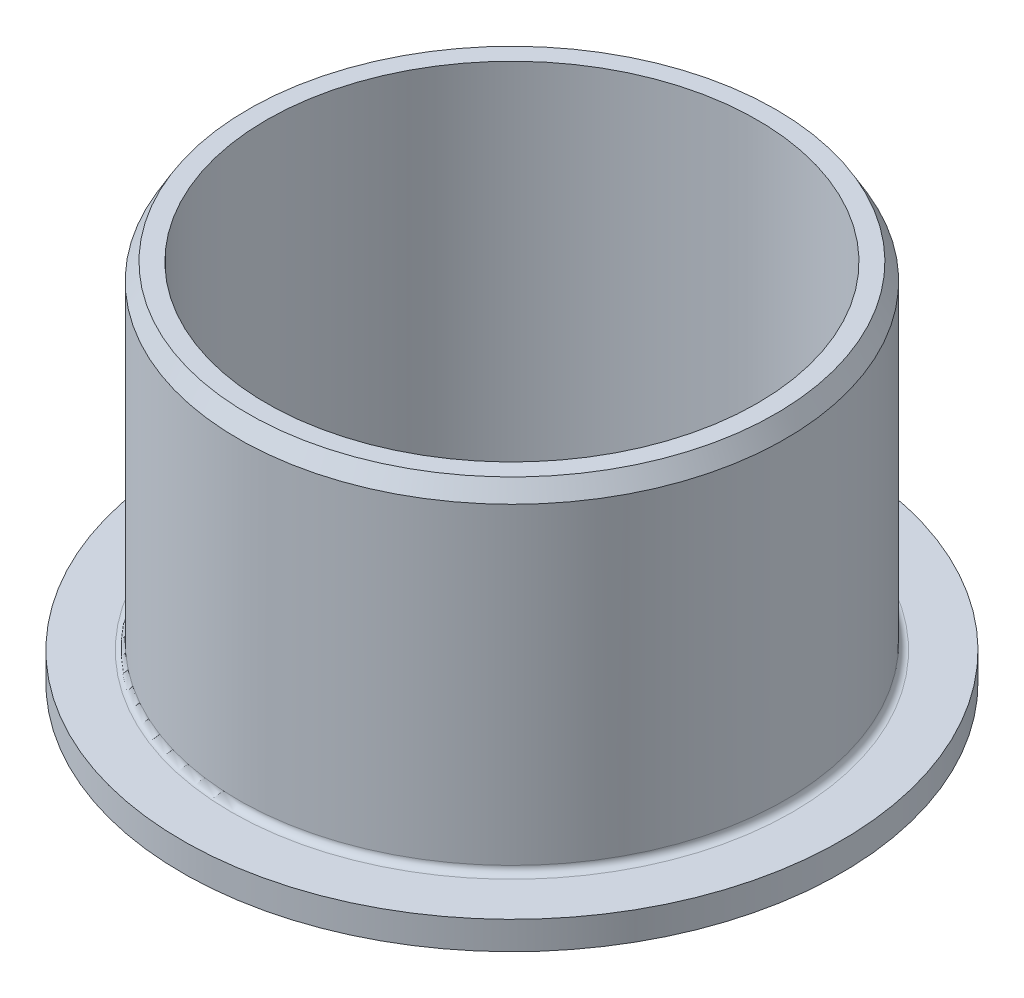
ISO-10303-21;
HEADER;
FILE_DESCRIPTION(('STEP AP214'),'2;1');
FILE_NAME('part.step','',(''),(''),'','','');
FILE_SCHEMA(('AUTOMOTIVE_DESIGN { 1 0 10303 214 1 1 1 1 }'));
ENDSEC;
DATA;
#1=APPLICATION_CONTEXT('core data for automotive mechanical design processes');
#2=APPLICATION_PROTOCOL_DEFINITION('international standard','automotive_design',2000,#1);
#3=PRODUCT_CONTEXT('',#1,'mechanical');
#4=PRODUCT('Part','Part','',(#3));
#5=PRODUCT_RELATED_PRODUCT_CATEGORY('part','',(#4));
#6=PRODUCT_DEFINITION_FORMATION('','',#4);
#7=PRODUCT_DEFINITION_CONTEXT('part definition',#1,'design');
#8=PRODUCT_DEFINITION('design','',#6,#7);
#9=PRODUCT_DEFINITION_SHAPE('','',#8);
#10=(LENGTH_UNIT() NAMED_UNIT(*) SI_UNIT(.MILLI.,.METRE.));
#11=(NAMED_UNIT(*) PLANE_ANGLE_UNIT() SI_UNIT($,.RADIAN.));
#12=(NAMED_UNIT(*) SI_UNIT($,.STERADIAN.) SOLID_ANGLE_UNIT());
#13=UNCERTAINTY_MEASURE_WITH_UNIT(LENGTH_MEASURE(1.E-05),#10,'distance_accuracy_value','');
#14=(GEOMETRIC_REPRESENTATION_CONTEXT(3) GLOBAL_UNCERTAINTY_ASSIGNED_CONTEXT((#13)) GLOBAL_UNIT_ASSIGNED_CONTEXT((#10,
#11,#12)) REPRESENTATION_CONTEXT('',''));
#15=CARTESIAN_POINT('',(0.,0.,0.));
#16=DIRECTION('',(0.,0.,1.));
#17=DIRECTION('',(1.,0.,0.));
#18=AXIS2_PLACEMENT_3D('',#15,#16,#17);
#19=CARTESIAN_POINT('',(-196.686091028788,-277.525070596183,-866.48578652296));
#20=DIRECTION('',(0.,1.,0.));
#21=DIRECTION('',(-1.,0.,0.));
#22=AXIS2_PLACEMENT_3D('',#19,#20,#21);
#23=TOROIDAL_SURFACE('',#22,20.,0.500000000000007);
#24=CARTESIAN_POINT('',(-196.686091028788,-277.525070596183,-866.48578652296));
#25=DIRECTION('',(0.,1.,0.));
#26=DIRECTION('',(-1.,0.,0.));
#27=AXIS2_PLACEMENT_3D('',#24,#25,#26);
#28=CIRCLE('',#27,19.5);
#29=CARTESIAN_POINT('',(-216.186091028788,-277.525070596183,-866.48578652296));
#30=VERTEX_POINT('',#29);
#31=EDGE_CURVE('E43',#30,#30,#28,.T.);
#32=ORIENTED_EDGE('',*,*,#31,.F.);
#33=EDGE_LOOP('',(#32));
#34=FACE_BOUND('',#33,.T.);
#35=CARTESIAN_POINT('',(-196.686091028788,-278.025070596183,-866.48578652296));
#36=DIRECTION('',(0.,1.,0.));
#37=DIRECTION('',(-1.,0.,0.));
#38=AXIS2_PLACEMENT_3D('',#35,#36,#37);
#39=CIRCLE('',#38,20.);
#40=CARTESIAN_POINT('',(-176.686091028788,-278.025070596183,-866.48578652296));
#41=VERTEX_POINT('',#40);
#42=CARTESIAN_POINT('',(-216.686091028788,-278.025070596183,-866.48578652296));
#43=VERTEX_POINT('',#42);
#44=EDGE_CURVE('E35',#41,#43,#39,.F.);
#45=ORIENTED_EDGE('',*,*,#44,.F.);
#46=CARTESIAN_POINT('',(-196.686091028788,-278.025070596183,-866.48578652296));
#47=DIRECTION('',(0.,1.,0.));
#48=DIRECTION('',(1.,0.,0.));
#49=AXIS2_PLACEMENT_3D('',#46,#47,#48);
#50=CIRCLE('',#49,20.);
#51=EDGE_CURVE('E38',#43,#41,#50,.F.);
#52=ORIENTED_EDGE('',*,*,#51,.F.);
#53=EDGE_LOOP('',(#45,#52));
#54=FACE_BOUND('',#53,.T.);
#55=ADVANCED_FACE('F17',(#34,#54),#23,.F.);
#56=CARTESIAN_POINT('',(-218.436091028788,-278.025070596184,-866.48578652296));
#57=DIRECTION('',(0.,1.,0.));
#58=DIRECTION('',(-1.,0.,0.));
#59=AXIS2_PLACEMENT_3D('',#56,#57,#58);
#60=PLANE('',#59);
#61=ORIENTED_EDGE('',*,*,#44,.T.);
#62=ORIENTED_EDGE('',*,*,#51,.T.);
#63=EDGE_LOOP('',(#61,#62));
#64=FACE_BOUND('',#63,.T.);
#65=CARTESIAN_POINT('',(-196.686091028788,-278.025070596184,-866.48578652296));
#66=DIRECTION('',(0.,1.,0.));
#67=DIRECTION('',(-1.,0.,0.));
#68=AXIS2_PLACEMENT_3D('',#65,#66,#67);
#69=CIRCLE('',#68,23.5);
#70=CARTESIAN_POINT('',(-220.186091028788,-278.025070596184,-866.48578652296));
#71=VERTEX_POINT('',#70);
#72=EDGE_CURVE('E67',#71,#71,#69,.F.);
#73=ORIENTED_EDGE('',*,*,#72,.F.);
#74=EDGE_LOOP('',(#73));
#75=FACE_BOUND('',#74,.T.);
#76=ADVANCED_FACE('F40',(#64,#75),#60,.T.);
#77=CARTESIAN_POINT('',(-196.686091028788,-266.375070596182,-866.48578652296));
#78=DIRECTION('',(0.,1.,0.));
#79=DIRECTION('',(-1.,0.,0.));
#80=AXIS2_PLACEMENT_3D('',#77,#78,#79);
#81=CYLINDRICAL_SURFACE('',#80,19.5);
#82=CARTESIAN_POINT('',(-196.686091028788,-255.225070596183,-866.48578652296));
#83=DIRECTION('',(0.,-1.,0.));
#84=DIRECTION('',(-1.,0.,0.));
#85=AXIS2_PLACEMENT_3D('',#82,#83,#84);
#86=CIRCLE('',#85,19.4999999999997);
#87=CARTESIAN_POINT('',(-216.186091028788,-255.225070596183,-866.48578652296));
#88=VERTEX_POINT('',#87);
#89=EDGE_CURVE('E66',#88,#88,#86,.F.);
#90=ORIENTED_EDGE('',*,*,#89,.F.);
#91=EDGE_LOOP('',(#90));
#92=FACE_BOUND('',#91,.T.);
#93=ORIENTED_EDGE('',*,*,#31,.T.);
#94=EDGE_LOOP('',(#93));
#95=FACE_BOUND('',#94,.T.);
#96=ADVANCED_FACE('F86',(#92,#95),#81,.T.);
#97=CARTESIAN_POINT('',(-196.686091028788,-279.025070596182,-866.48578652296));
#98=DIRECTION('',(0.,1.,0.));
#99=DIRECTION('',(-1.,0.,0.));
#100=AXIS2_PLACEMENT_3D('',#97,#98,#99);
#101=CYLINDRICAL_SURFACE('',#100,23.5);
#102=CARTESIAN_POINT('',(-196.686091028788,-280.025070596183,-866.48578652296));
#103=DIRECTION('',(0.,1.,0.));
#104=DIRECTION('',(-1.,0.,0.));
#105=AXIS2_PLACEMENT_3D('',#102,#103,#104);
#106=CIRCLE('',#105,23.5);
#107=CARTESIAN_POINT('',(-220.186091028788,-280.025070596183,-866.48578652296));
#108=VERTEX_POINT('',#107);
#109=EDGE_CURVE('E63',#108,#108,#106,.F.);
#110=ORIENTED_EDGE('',*,*,#109,.F.);
#111=EDGE_LOOP('',(#110));
#112=FACE_BOUND('',#111,.T.);
#113=ORIENTED_EDGE('',*,*,#72,.T.);
#114=EDGE_LOOP('',(#113));
#115=FACE_BOUND('',#114,.T.);
#116=ADVANCED_FACE('F97',(#112,#115),#101,.T.);
#117=CARTESIAN_POINT('',(-196.686091028788,-255.225070596183,-866.48578652296));
#118=DIRECTION('',(0.,-1.,0.));
#119=DIRECTION('',(0.,0.,-1.));
#120=AXIS2_PLACEMENT_3D('',#117,#118,#119);
#121=CONICAL_SURFACE('',#120,19.4999999999997,0.523598775598301);
#122=ORIENTED_EDGE('',*,*,#89,.T.);
#123=EDGE_LOOP('',(#122));
#124=FACE_BOUND('',#123,.T.);
#125=CARTESIAN_POINT('',(-196.686091028788,-254.025070596183,-866.48578652296));
#126=DIRECTION('',(0.,-1.,0.));
#127=DIRECTION('',(0.,0.,-1.));
#128=AXIS2_PLACEMENT_3D('',#125,#126,#127);
#129=CIRCLE('',#128,18.8071796769721);
#130=CARTESIAN_POINT('',(-196.686091028788,-254.025070596183,-885.292966199932));
#131=VERTEX_POINT('',#130);
#132=EDGE_CURVE('E60',#131,#131,#129,.F.);
#133=ORIENTED_EDGE('',*,*,#132,.F.);
#134=EDGE_LOOP('',(#133));
#135=FACE_BOUND('',#134,.T.);
#136=ADVANCED_FACE('F101',(#124,#135),#121,.T.);
#137=CARTESIAN_POINT('',(-217.186091028788,-280.025070596183,-866.48578652296));
#138=DIRECTION('',(0.,-1.,0.));
#139=DIRECTION('',(1.,0.,0.));
#140=AXIS2_PLACEMENT_3D('',#137,#138,#139);
#141=PLANE('',#140);
#142=CARTESIAN_POINT('',(-196.686091028788,-280.025070596183,-866.48578652296));
#143=DIRECTION('',(0.,1.,0.));
#144=DIRECTION('',(-1.,0.,0.));
#145=AXIS2_PLACEMENT_3D('',#142,#143,#144);
#146=CIRCLE('',#145,17.5);
#147=CARTESIAN_POINT('',(-214.186091028788,-280.025070596183,-866.48578652296));
#148=VERTEX_POINT('',#147);
#149=EDGE_CURVE('E28',#148,#148,#146,.T.);
#150=ORIENTED_EDGE('',*,*,#149,.T.);
#151=EDGE_LOOP('',(#150));
#152=FACE_BOUND('',#151,.T.);
#153=ORIENTED_EDGE('',*,*,#109,.T.);
#154=EDGE_LOOP('',(#153));
#155=FACE_BOUND('',#154,.T.);
#156=ADVANCED_FACE('F105',(#152,#155),#141,.T.);
#157=CARTESIAN_POINT('',(-214.839680867274,-254.025070596183,-866.48578652296));
#158=DIRECTION('',(0.,1.,0.));
#159=DIRECTION('',(-1.,0.,0.));
#160=AXIS2_PLACEMENT_3D('',#157,#158,#159);
#161=PLANE('',#160);
#162=CARTESIAN_POINT('',(-196.686091028788,-254.025070596183,-866.48578652296));
#163=DIRECTION('',(0.,1.,0.));
#164=DIRECTION('',(-1.,0.,0.));
#165=AXIS2_PLACEMENT_3D('',#162,#163,#164);
#166=CIRCLE('',#165,17.5);
#167=CARTESIAN_POINT('',(-214.186091028788,-254.025070596183,-866.48578652296));
#168=VERTEX_POINT('',#167);
#169=EDGE_CURVE('E11',#168,#168,#166,.F.);
#170=ORIENTED_EDGE('',*,*,#169,.T.);
#171=EDGE_LOOP('',(#170));
#172=FACE_BOUND('',#171,.T.);
#173=ORIENTED_EDGE('',*,*,#132,.T.);
#174=EDGE_LOOP('',(#173));
#175=FACE_BOUND('',#174,.T.);
#176=ADVANCED_FACE('F109',(#172,#175),#161,.T.);
#177=CARTESIAN_POINT('',(-196.686091028788,-267.025070596182,-866.48578652296));
#178=DIRECTION('',(0.,1.,0.));
#179=DIRECTION('',(-1.,0.,0.));
#180=AXIS2_PLACEMENT_3D('',#177,#178,#179);
#181=CYLINDRICAL_SURFACE('',#180,17.5);
#182=ORIENTED_EDGE('',*,*,#149,.F.);
#183=EDGE_LOOP('',(#182));
#184=FACE_BOUND('',#183,.T.);
#185=ORIENTED_EDGE('',*,*,#169,.F.);
#186=EDGE_LOOP('',(#185));
#187=FACE_BOUND('',#186,.T.);
#188=ADVANCED_FACE('F113',(#184,#187),#181,.F.);
#189=CLOSED_SHELL('',(#55,#76,#96,#116,#136,#156,#176,#188));
#190=MANIFOLD_SOLID_BREP('B1',#189);
#191=ADVANCED_BREP_SHAPE_REPRESENTATION('',(#18,#190),#14);
#192=SHAPE_DEFINITION_REPRESENTATION(#9,#191);
ENDSEC;
END-ISO-10303-21;
